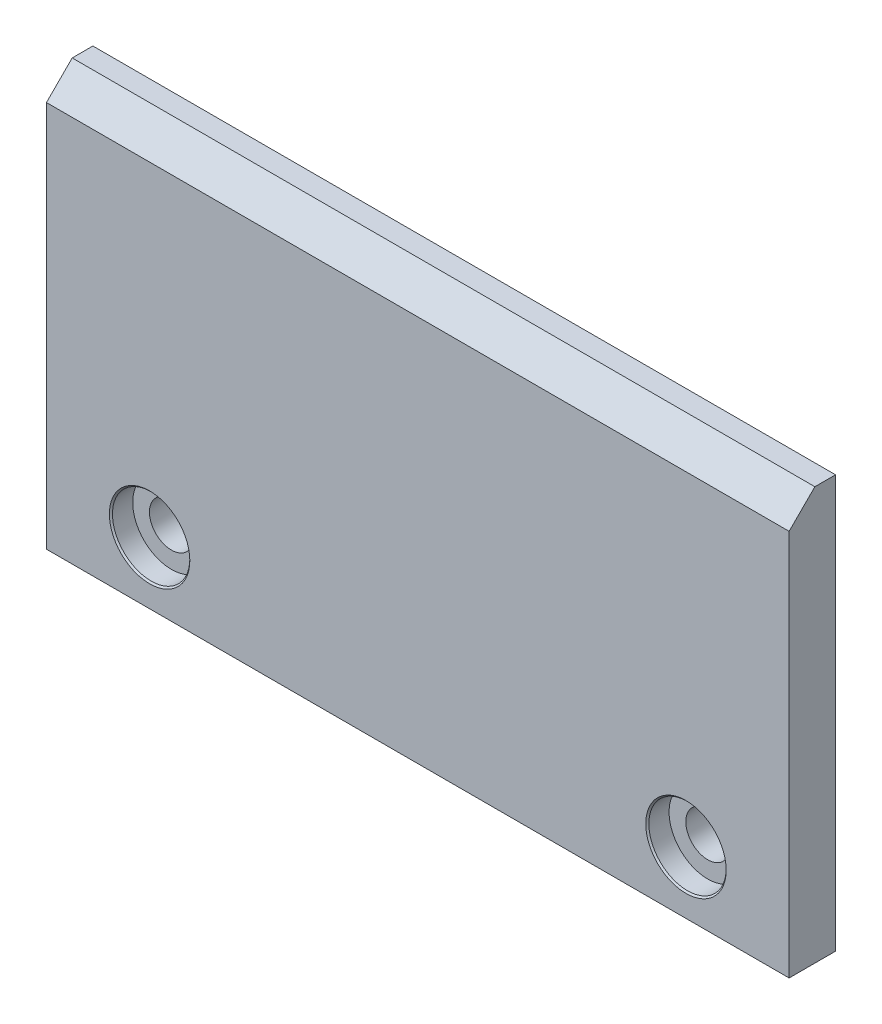
ISO-10303-21;
HEADER;
FILE_DESCRIPTION(('STEP AP214'),'2;1');
FILE_NAME('part.step','',(''),(''),'','','');
FILE_SCHEMA(('AUTOMOTIVE_DESIGN { 1 0 10303 214 1 1 1 1 }'));
ENDSEC;
DATA;
#1=APPLICATION_CONTEXT('core data for automotive mechanical design processes');
#2=APPLICATION_PROTOCOL_DEFINITION('international standard','automotive_design',2000,#1);
#3=PRODUCT_CONTEXT('',#1,'mechanical');
#4=PRODUCT('Part','Part','',(#3));
#5=PRODUCT_RELATED_PRODUCT_CATEGORY('part','',(#4));
#6=PRODUCT_DEFINITION_FORMATION('','',#4);
#7=PRODUCT_DEFINITION_CONTEXT('part definition',#1,'design');
#8=PRODUCT_DEFINITION('design','',#6,#7);
#9=PRODUCT_DEFINITION_SHAPE('','',#8);
#10=(LENGTH_UNIT() NAMED_UNIT(*) SI_UNIT(.MILLI.,.METRE.));
#11=(NAMED_UNIT(*) PLANE_ANGLE_UNIT() SI_UNIT($,.RADIAN.));
#12=(NAMED_UNIT(*) SI_UNIT($,.STERADIAN.) SOLID_ANGLE_UNIT());
#13=UNCERTAINTY_MEASURE_WITH_UNIT(LENGTH_MEASURE(1.E-05),#10,'distance_accuracy_value','');
#14=(GEOMETRIC_REPRESENTATION_CONTEXT(3) GLOBAL_UNCERTAINTY_ASSIGNED_CONTEXT((#13)) GLOBAL_UNIT_ASSIGNED_CONTEXT((#10,
#11,#12)) REPRESENTATION_CONTEXT('',''));
#15=CARTESIAN_POINT('',(0.,0.,0.));
#16=DIRECTION('',(0.,0.,1.));
#17=DIRECTION('',(1.,0.,0.));
#18=AXIS2_PLACEMENT_3D('',#15,#16,#17);
#19=CARTESIAN_POINT('',(-114.3,0.,-7.14375000000001));
#20=DIRECTION('',(0.,-1.,0.));
#21=DIRECTION('',(0.,0.,-1.));
#22=AXIS2_PLACEMENT_3D('',#19,#20,#21);
#23=PLANE('',#22);
#24=DIRECTION('',(0.,0.,-1.));
#25=VECTOR('',#24,1.);
#26=CARTESIAN_POINT('',(0.,0.,-7.14375000000001));
#27=LINE('',#26,#25);
#28=CARTESIAN_POINT('',(0.,0.,0.));
#29=VERTEX_POINT('',#28);
#30=CARTESIAN_POINT('',(0.,0.,-7.14375000000001));
#31=VERTEX_POINT('',#30);
#32=EDGE_CURVE('E113',#29,#31,#27,.T.);
#33=ORIENTED_EDGE('',*,*,#32,.F.);
#34=DIRECTION('',(1.,0.,0.));
#35=VECTOR('',#34,1.);
#36=CARTESIAN_POINT('',(-114.3,0.,0.));
#37=LINE('',#36,#35);
#38=CARTESIAN_POINT('',(-114.3,0.,0.));
#39=VERTEX_POINT('',#38);
#40=EDGE_CURVE('E102',#39,#29,#37,.T.);
#41=ORIENTED_EDGE('',*,*,#40,.F.);
#42=DIRECTION('',(0.,0.,-1.));
#43=VECTOR('',#42,1.);
#44=CARTESIAN_POINT('',(-114.3,0.,-7.14375000000001));
#45=LINE('',#44,#43);
#46=CARTESIAN_POINT('',(-114.3,0.,-7.14375000000001));
#47=VERTEX_POINT('',#46);
#48=EDGE_CURVE('E96',#39,#47,#45,.T.);
#49=ORIENTED_EDGE('',*,*,#48,.T.);
#50=DIRECTION('',(1.,0.,0.));
#51=VECTOR('',#50,1.);
#52=CARTESIAN_POINT('',(-114.3,0.,-7.14375000000001));
#53=LINE('',#52,#51);
#54=EDGE_CURVE('E79',#47,#31,#53,.T.);
#55=ORIENTED_EDGE('',*,*,#54,.T.);
#56=EDGE_LOOP('',(#33,#41,#49,#55));
#57=FACE_BOUND('',#56,.T.);
#58=ADVANCED_FACE('F34',(#57),#23,.T.);
#59=CARTESIAN_POINT('',(-114.3,0.,0.));
#60=DIRECTION('',(0.,0.,1.));
#61=DIRECTION('',(1.,0.,0.));
#62=AXIS2_PLACEMENT_3D('',#59,#60,#61);
#63=PLANE('',#62);
#64=CARTESIAN_POINT('',(-98.425,9.525,0.));
#65=DIRECTION('',(0.,0.,1.));
#66=DIRECTION('',(1.,0.,0.));
#67=AXIS2_PLACEMENT_3D('',#64,#65,#66);
#68=CIRCLE('',#67,6.19125);
#69=CARTESIAN_POINT('',(-92.23375,9.525,0.));
#70=VERTEX_POINT('',#69);
#71=EDGE_CURVE('E189',#70,#70,#68,.T.);
#72=ORIENTED_EDGE('',*,*,#71,.F.);
#73=EDGE_LOOP('',(#72));
#74=FACE_BOUND('',#73,.T.);
#75=CARTESIAN_POINT('',(-15.875,9.525,0.));
#76=DIRECTION('',(0.,0.,1.));
#77=DIRECTION('',(1.,0.,0.));
#78=AXIS2_PLACEMENT_3D('',#75,#76,#77);
#79=CIRCLE('',#78,6.19125);
#80=CARTESIAN_POINT('',(-9.68375,9.525,0.));
#81=VERTEX_POINT('',#80);
#82=EDGE_CURVE('E201',#81,#81,#79,.T.);
#83=ORIENTED_EDGE('',*,*,#82,.F.);
#84=EDGE_LOOP('',(#83));
#85=FACE_BOUND('',#84,.T.);
#86=DIRECTION('',(0.,-1.,0.));
#87=VECTOR('',#86,1.);
#88=CARTESIAN_POINT('',(0.,0.,0.));
#89=LINE('',#88,#87);
#90=CARTESIAN_POINT('',(0.,59.5376,0.));
#91=VERTEX_POINT('',#90);
#92=EDGE_CURVE('E103',#91,#29,#89,.T.);
#93=ORIENTED_EDGE('',*,*,#92,.F.);
#94=DIRECTION('',(-1.,0.,0.));
#95=VECTOR('',#94,1.);
#96=CARTESIAN_POINT('',(-114.3,59.5376,0.));
#97=LINE('',#96,#95);
#98=CARTESIAN_POINT('',(-114.3,59.5376,0.));
#99=VERTEX_POINT('',#98);
#100=EDGE_CURVE('E42',#91,#99,#97,.T.);
#101=ORIENTED_EDGE('',*,*,#100,.T.);
#102=DIRECTION('',(0.,-1.,0.));
#103=VECTOR('',#102,1.);
#104=CARTESIAN_POINT('',(-114.3,0.,0.));
#105=LINE('',#104,#103);
#106=EDGE_CURVE('E90',#99,#39,#105,.T.);
#107=ORIENTED_EDGE('',*,*,#106,.T.);
#108=ORIENTED_EDGE('',*,*,#40,.T.);
#109=EDGE_LOOP('',(#93,#101,#107,#108));
#110=FACE_BOUND('',#109,.T.);
#111=ADVANCED_FACE('F129',(#74,#85,#110),#63,.T.);
#112=CARTESIAN_POINT('',(-114.3,63.5,0.));
#113=DIRECTION('',(0.,1.,0.));
#114=DIRECTION('',(0.,0.,1.));
#115=AXIS2_PLACEMENT_3D('',#112,#113,#114);
#116=PLANE('',#115);
#117=DIRECTION('',(0.,0.,1.));
#118=VECTOR('',#117,1.);
#119=CARTESIAN_POINT('',(-114.3,63.5,0.));
#120=LINE('',#119,#118);
#121=CARTESIAN_POINT('',(-114.3,63.5,-7.14375));
#122=VERTEX_POINT('',#121);
#123=CARTESIAN_POINT('',(-114.3,63.5,-3.9624));
#124=VERTEX_POINT('',#123);
#125=EDGE_CURVE('E98',#122,#124,#120,.T.);
#126=ORIENTED_EDGE('',*,*,#125,.T.);
#127=DIRECTION('',(1.,0.,0.));
#128=VECTOR('',#127,1.);
#129=CARTESIAN_POINT('',(-114.3,63.5,-3.96239999999999));
#130=LINE('',#129,#128);
#131=CARTESIAN_POINT('',(0.,63.5,-3.96239999999999));
#132=VERTEX_POINT('',#131);
#133=EDGE_CURVE('E118',#124,#132,#130,.T.);
#134=ORIENTED_EDGE('',*,*,#133,.T.);
#135=DIRECTION('',(0.,0.,1.));
#136=VECTOR('',#135,1.);
#137=CARTESIAN_POINT('',(0.,63.5,0.));
#138=LINE('',#137,#136);
#139=CARTESIAN_POINT('',(0.,63.5,-7.14375));
#140=VERTEX_POINT('',#139);
#141=EDGE_CURVE('E105',#140,#132,#138,.T.);
#142=ORIENTED_EDGE('',*,*,#141,.F.);
#143=DIRECTION('',(1.,0.,0.));
#144=VECTOR('',#143,1.);
#145=CARTESIAN_POINT('',(-114.3,63.5,-7.14375));
#146=LINE('',#145,#144);
#147=EDGE_CURVE('E89',#122,#140,#146,.T.);
#148=ORIENTED_EDGE('',*,*,#147,.F.);
#149=EDGE_LOOP('',(#126,#134,#142,#148));
#150=FACE_BOUND('',#149,.T.);
#151=ADVANCED_FACE('F125',(#150),#116,.T.);
#152=CARTESIAN_POINT('',(-114.3,63.5,-7.14375));
#153=DIRECTION('',(0.,0.,-1.));
#154=DIRECTION('',(0.,1.,0.));
#155=AXIS2_PLACEMENT_3D('',#152,#153,#154);
#156=PLANE('',#155);
#157=CARTESIAN_POINT('',(-98.425,9.525,-7.14375000000001));
#158=DIRECTION('',(0.,0.,1.));
#159=DIRECTION('',(1.,0.,0.));
#160=AXIS2_PLACEMENT_3D('',#157,#158,#159);
#161=CIRCLE('',#160,3.3782);
#162=CARTESIAN_POINT('',(-95.0468,9.525,-7.14375000000001));
#163=VERTEX_POINT('',#162);
#164=EDGE_CURVE('E198',#163,#163,#161,.T.);
#165=ORIENTED_EDGE('',*,*,#164,.T.);
#166=EDGE_LOOP('',(#165));
#167=FACE_BOUND('',#166,.T.);
#168=CARTESIAN_POINT('',(-15.875,9.525,-7.14375000000001));
#169=DIRECTION('',(0.,0.,1.));
#170=DIRECTION('',(1.,0.,0.));
#171=AXIS2_PLACEMENT_3D('',#168,#169,#170);
#172=CIRCLE('',#171,3.3782);
#173=CARTESIAN_POINT('',(-12.4968,9.525,-7.14375000000001));
#174=VERTEX_POINT('',#173);
#175=EDGE_CURVE('E108',#174,#174,#172,.T.);
#176=ORIENTED_EDGE('',*,*,#175,.T.);
#177=EDGE_LOOP('',(#176));
#178=FACE_BOUND('',#177,.T.);
#179=DIRECTION('',(0.,1.,0.));
#180=VECTOR('',#179,1.);
#181=CARTESIAN_POINT('',(0.,63.5,-7.14375));
#182=LINE('',#181,#180);
#183=EDGE_CURVE('E84',#31,#140,#182,.T.);
#184=ORIENTED_EDGE('',*,*,#183,.F.);
#185=ORIENTED_EDGE('',*,*,#54,.F.);
#186=DIRECTION('',(0.,1.,0.));
#187=VECTOR('',#186,1.);
#188=CARTESIAN_POINT('',(-114.3,63.5,-7.14375));
#189=LINE('',#188,#187);
#190=EDGE_CURVE('E82',#47,#122,#189,.T.);
#191=ORIENTED_EDGE('',*,*,#190,.T.);
#192=ORIENTED_EDGE('',*,*,#147,.T.);
#193=EDGE_LOOP('',(#184,#185,#191,#192));
#194=FACE_BOUND('',#193,.T.);
#195=ADVANCED_FACE('F81',(#167,#178,#194),#156,.T.);
#196=CARTESIAN_POINT('',(-114.3,0.,0.));
#197=DIRECTION('',(-1.,0.,0.));
#198=DIRECTION('',(0.,0.,1.));
#199=AXIS2_PLACEMENT_3D('',#196,#197,#198);
#200=PLANE('',#199);
#201=ORIENTED_EDGE('',*,*,#106,.F.);
#202=DIRECTION('',(0.,-0.707106781186549,0.707106781186546));
#203=VECTOR('',#202,1.);
#204=CARTESIAN_POINT('',(-114.3,29.7687999999998,29.7688));
#205=LINE('',#204,#203);
#206=EDGE_CURVE('E11',#99,#124,#205,.F.);
#207=ORIENTED_EDGE('',*,*,#206,.T.);
#208=ORIENTED_EDGE('',*,*,#125,.F.);
#209=ORIENTED_EDGE('',*,*,#190,.F.);
#210=ORIENTED_EDGE('',*,*,#48,.F.);
#211=EDGE_LOOP('',(#201,#207,#208,#209,#210));
#212=FACE_BOUND('',#211,.T.);
#213=ADVANCED_FACE('F95',(#212),#200,.T.);
#214=CARTESIAN_POINT('',(0.,0.,0.));
#215=DIRECTION('',(-1.,0.,0.));
#216=DIRECTION('',(0.,0.,1.));
#217=AXIS2_PLACEMENT_3D('',#214,#215,#216);
#218=PLANE('',#217);
#219=ORIENTED_EDGE('',*,*,#141,.T.);
#220=DIRECTION('',(0.,0.707106781186549,-0.707106781186546));
#221=VECTOR('',#220,1.);
#222=CARTESIAN_POINT('',(0.,63.5,-3.96239999999999));
#223=LINE('',#222,#221);
#224=EDGE_CURVE('E56',#132,#91,#223,.F.);
#225=ORIENTED_EDGE('',*,*,#224,.T.);
#226=ORIENTED_EDGE('',*,*,#92,.T.);
#227=ORIENTED_EDGE('',*,*,#32,.T.);
#228=ORIENTED_EDGE('',*,*,#183,.T.);
#229=EDGE_LOOP('',(#219,#225,#226,#227,#228));
#230=FACE_BOUND('',#229,.T.);
#231=ADVANCED_FACE('F128',(#230),#218,.F.);
#232=CARTESIAN_POINT('',(-15.875,9.525,0.));
#233=DIRECTION('',(0.,0.,1.));
#234=DIRECTION('',(1.,0.,0.));
#235=AXIS2_PLACEMENT_3D('',#232,#233,#234);
#236=CYLINDRICAL_SURFACE('',#235,3.3782);
#237=ORIENTED_EDGE('',*,*,#175,.F.);
#238=EDGE_LOOP('',(#237));
#239=FACE_BOUND('',#238,.T.);
#240=CARTESIAN_POINT('',(-15.875,9.525,-3.3528));
#241=DIRECTION('',(0.,0.,1.));
#242=DIRECTION('',(1.,0.,0.));
#243=AXIS2_PLACEMENT_3D('',#240,#241,#242);
#244=CIRCLE('',#243,3.3782);
#245=CARTESIAN_POINT('',(-12.4968,9.525,-3.3528));
#246=VERTEX_POINT('',#245);
#247=EDGE_CURVE('E209',#246,#246,#244,.T.);
#248=ORIENTED_EDGE('',*,*,#247,.T.);
#249=EDGE_LOOP('',(#248));
#250=FACE_BOUND('',#249,.T.);
#251=ADVANCED_FACE('F152',(#239,#250),#236,.F.);
#252=CARTESIAN_POINT('',(-9.92124,9.525,-3.3528));
#253=DIRECTION('',(0.,0.,-1.));
#254=DIRECTION('',(-1.,0.,0.));
#255=AXIS2_PLACEMENT_3D('',#252,#253,#254);
#256=PLANE('',#255);
#257=ORIENTED_EDGE('',*,*,#247,.F.);
#258=EDGE_LOOP('',(#257));
#259=FACE_BOUND('',#258,.T.);
#260=CARTESIAN_POINT('',(-15.875,9.525,-3.3528));
#261=DIRECTION('',(0.,0.,1.));
#262=DIRECTION('',(1.,0.,0.));
#263=AXIS2_PLACEMENT_3D('',#260,#261,#262);
#264=CIRCLE('',#263,5.95376);
#265=CARTESIAN_POINT('',(-9.92124,9.525,-3.3528));
#266=VERTEX_POINT('',#265);
#267=EDGE_CURVE('E207',#266,#266,#264,.T.);
#268=ORIENTED_EDGE('',*,*,#267,.T.);
#269=EDGE_LOOP('',(#268));
#270=FACE_BOUND('',#269,.T.);
#271=ADVANCED_FACE('F157',(#259,#270),#256,.F.);
#272=CARTESIAN_POINT('',(-15.875,9.525,0.));
#273=DIRECTION('',(0.,0.,1.));
#274=DIRECTION('',(1.,0.,0.));
#275=AXIS2_PLACEMENT_3D('',#272,#273,#274);
#276=CYLINDRICAL_SURFACE('',#275,5.95376);
#277=ORIENTED_EDGE('',*,*,#267,.F.);
#278=EDGE_LOOP('',(#277));
#279=FACE_BOUND('',#278,.T.);
#280=CARTESIAN_POINT('',(-15.875,9.525,-0.237490000000001));
#281=DIRECTION('',(0.,0.,1.));
#282=DIRECTION('',(1.,0.,0.));
#283=AXIS2_PLACEMENT_3D('',#280,#281,#282);
#284=CIRCLE('',#283,5.95376);
#285=CARTESIAN_POINT('',(-9.92124,9.525,-0.237490000000001));
#286=VERTEX_POINT('',#285);
#287=EDGE_CURVE('E204',#286,#286,#284,.T.);
#288=ORIENTED_EDGE('',*,*,#287,.T.);
#289=EDGE_LOOP('',(#288));
#290=FACE_BOUND('',#289,.T.);
#291=ADVANCED_FACE('F161',(#279,#290),#276,.F.);
#292=CARTESIAN_POINT('',(-15.875,9.525,0.));
#293=DIRECTION('',(0.,0.,1.));
#294=DIRECTION('',(1.,0.,0.));
#295=AXIS2_PLACEMENT_3D('',#292,#293,#294);
#296=CONICAL_SURFACE('',#295,6.19125,0.78539816339744);
#297=ORIENTED_EDGE('',*,*,#287,.F.);
#298=EDGE_LOOP('',(#297));
#299=FACE_BOUND('',#298,.T.);
#300=ORIENTED_EDGE('',*,*,#82,.T.);
#301=EDGE_LOOP('',(#300));
#302=FACE_BOUND('',#301,.T.);
#303=ADVANCED_FACE('F165',(#299,#302),#296,.F.);
#304=CARTESIAN_POINT('',(-98.425,9.525,0.));
#305=DIRECTION('',(0.,0.,1.));
#306=DIRECTION('',(1.,0.,0.));
#307=AXIS2_PLACEMENT_3D('',#304,#305,#306);
#308=CYLINDRICAL_SURFACE('',#307,3.3782);
#309=ORIENTED_EDGE('',*,*,#164,.F.);
#310=EDGE_LOOP('',(#309));
#311=FACE_BOUND('',#310,.T.);
#312=CARTESIAN_POINT('',(-98.425,9.525,-3.3528));
#313=DIRECTION('',(0.,0.,1.));
#314=DIRECTION('',(1.,0.,0.));
#315=AXIS2_PLACEMENT_3D('',#312,#313,#314);
#316=CIRCLE('',#315,3.3782);
#317=CARTESIAN_POINT('',(-95.0468,9.525,-3.3528));
#318=VERTEX_POINT('',#317);
#319=EDGE_CURVE('E191',#318,#318,#316,.T.);
#320=ORIENTED_EDGE('',*,*,#319,.T.);
#321=EDGE_LOOP('',(#320));
#322=FACE_BOUND('',#321,.T.);
#323=ADVANCED_FACE('F169',(#311,#322),#308,.F.);
#324=CARTESIAN_POINT('',(-92.47124,9.525,-3.3528));
#325=DIRECTION('',(0.,0.,-1.));
#326=DIRECTION('',(-1.,0.,0.));
#327=AXIS2_PLACEMENT_3D('',#324,#325,#326);
#328=PLANE('',#327);
#329=ORIENTED_EDGE('',*,*,#319,.F.);
#330=EDGE_LOOP('',(#329));
#331=FACE_BOUND('',#330,.T.);
#332=CARTESIAN_POINT('',(-98.425,9.525,-3.3528));
#333=DIRECTION('',(0.,0.,1.));
#334=DIRECTION('',(1.,0.,0.));
#335=AXIS2_PLACEMENT_3D('',#332,#333,#334);
#336=CIRCLE('',#335,5.95376);
#337=CARTESIAN_POINT('',(-92.47124,9.525,-3.3528));
#338=VERTEX_POINT('',#337);
#339=EDGE_CURVE('E185',#338,#338,#336,.T.);
#340=ORIENTED_EDGE('',*,*,#339,.T.);
#341=EDGE_LOOP('',(#340));
#342=FACE_BOUND('',#341,.T.);
#343=ADVANCED_FACE('F173',(#331,#342),#328,.F.);
#344=CARTESIAN_POINT('',(-98.425,9.525,0.));
#345=DIRECTION('',(0.,0.,1.));
#346=DIRECTION('',(1.,0.,0.));
#347=AXIS2_PLACEMENT_3D('',#344,#345,#346);
#348=CYLINDRICAL_SURFACE('',#347,5.95376);
#349=ORIENTED_EDGE('',*,*,#339,.F.);
#350=EDGE_LOOP('',(#349));
#351=FACE_BOUND('',#350,.T.);
#352=CARTESIAN_POINT('',(-98.425,9.525,-0.237490000000001));
#353=DIRECTION('',(0.,0.,1.));
#354=DIRECTION('',(1.,0.,0.));
#355=AXIS2_PLACEMENT_3D('',#352,#353,#354);
#356=CIRCLE('',#355,5.95376);
#357=CARTESIAN_POINT('',(-92.47124,9.525,-0.237490000000001));
#358=VERTEX_POINT('',#357);
#359=EDGE_CURVE('E188',#358,#358,#356,.T.);
#360=ORIENTED_EDGE('',*,*,#359,.T.);
#361=EDGE_LOOP('',(#360));
#362=FACE_BOUND('',#361,.T.);
#363=ADVANCED_FACE('F135',(#351,#362),#348,.F.);
#364=CARTESIAN_POINT('',(-98.425,9.525,0.));
#365=DIRECTION('',(0.,0.,1.));
#366=DIRECTION('',(1.,0.,0.));
#367=AXIS2_PLACEMENT_3D('',#364,#365,#366);
#368=CONICAL_SURFACE('',#367,6.19125,0.785398163397426);
#369=ORIENTED_EDGE('',*,*,#359,.F.);
#370=EDGE_LOOP('',(#369));
#371=FACE_BOUND('',#370,.T.);
#372=ORIENTED_EDGE('',*,*,#71,.T.);
#373=EDGE_LOOP('',(#372));
#374=FACE_BOUND('',#373,.T.);
#375=ADVANCED_FACE('F131',(#371,#374),#368,.F.);
#376=CARTESIAN_POINT('',(-114.3,63.5,-3.96239999999999));
#377=DIRECTION('',(0.,-0.707106781186546,-0.707106781186549));
#378=DIRECTION('',(1.,0.,0.));
#379=AXIS2_PLACEMENT_3D('',#376,#377,#378);
#380=PLANE('',#379);
#381=ORIENTED_EDGE('',*,*,#206,.F.);
#382=ORIENTED_EDGE('',*,*,#100,.F.);
#383=ORIENTED_EDGE('',*,*,#224,.F.);
#384=ORIENTED_EDGE('',*,*,#133,.F.);
#385=EDGE_LOOP('',(#381,#382,#383,#384));
#386=FACE_BOUND('',#385,.T.);
#387=ADVANCED_FACE('F36',(#386),#380,.F.);
#388=CLOSED_SHELL('',(#58,#111,#151,#195,#213,#231,#251,#271,#291,#303,#323,#343,#363,#375,#387));
#389=MANIFOLD_SOLID_BREP('B2',#388);
#390=ADVANCED_BREP_SHAPE_REPRESENTATION('',(#18,#389),#14);
#391=SHAPE_DEFINITION_REPRESENTATION(#9,#390);
ENDSEC;
END-ISO-10303-21;
